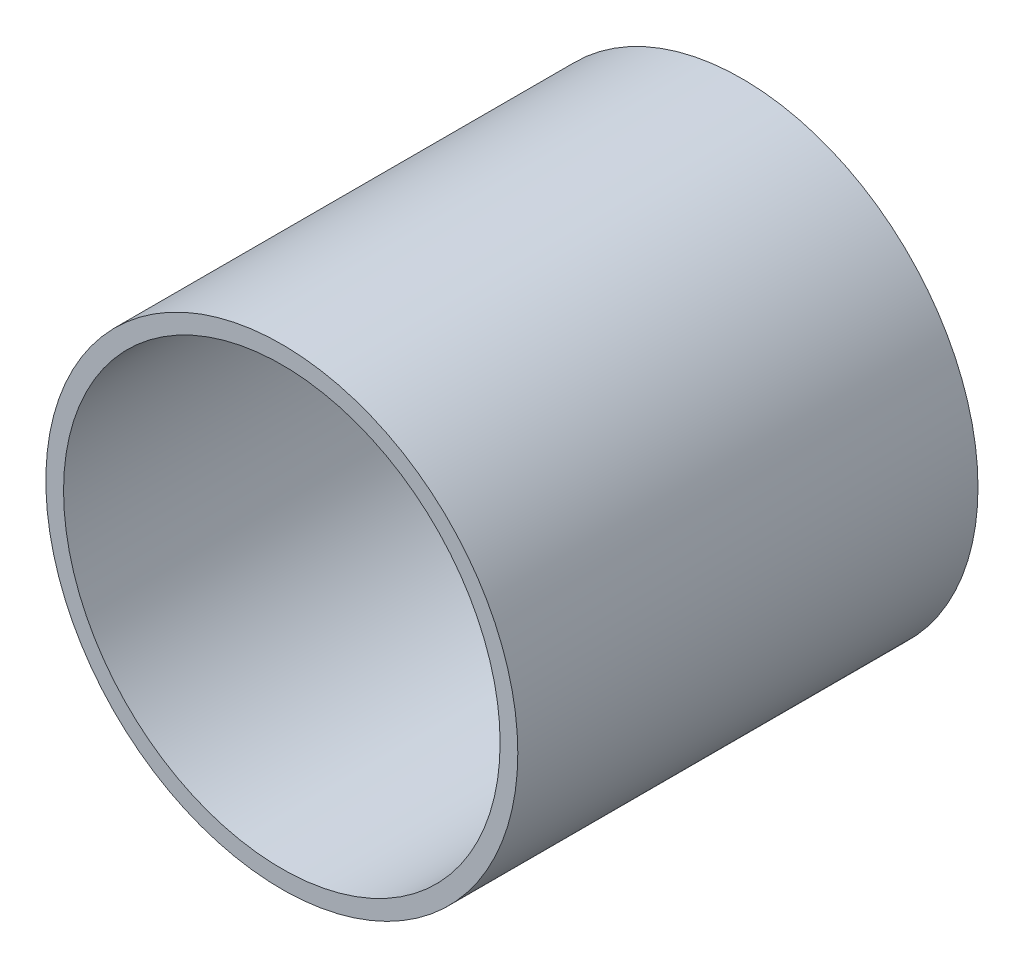
ISO-10303-21;
HEADER;
FILE_DESCRIPTION(('STEP AP214'),'2;1');
FILE_NAME('part.step','',(''),(''),'','','');
FILE_SCHEMA(('AUTOMOTIVE_DESIGN { 1 0 10303 214 1 1 1 1 }'));
ENDSEC;
DATA;
#1=APPLICATION_CONTEXT('core data for automotive mechanical design processes');
#2=APPLICATION_PROTOCOL_DEFINITION('international standard','automotive_design',2000,#1);
#3=PRODUCT_CONTEXT('',#1,'mechanical');
#4=PRODUCT('Part','Part','',(#3));
#5=PRODUCT_RELATED_PRODUCT_CATEGORY('part','',(#4));
#6=PRODUCT_DEFINITION_FORMATION('','',#4);
#7=PRODUCT_DEFINITION_CONTEXT('part definition',#1,'design');
#8=PRODUCT_DEFINITION('design','',#6,#7);
#9=PRODUCT_DEFINITION_SHAPE('','',#8);
#10=(LENGTH_UNIT() NAMED_UNIT(*) SI_UNIT(.MILLI.,.METRE.));
#11=(NAMED_UNIT(*) PLANE_ANGLE_UNIT() SI_UNIT($,.RADIAN.));
#12=(NAMED_UNIT(*) SI_UNIT($,.STERADIAN.) SOLID_ANGLE_UNIT());
#13=UNCERTAINTY_MEASURE_WITH_UNIT(LENGTH_MEASURE(1.E-05),#10,'distance_accuracy_value','');
#14=(GEOMETRIC_REPRESENTATION_CONTEXT(3) GLOBAL_UNCERTAINTY_ASSIGNED_CONTEXT((#13)) GLOBAL_UNIT_ASSIGNED_CONTEXT((#10,
#11,#12)) REPRESENTATION_CONTEXT('',''));
#15=CARTESIAN_POINT('',(0.,0.,0.));
#16=DIRECTION('',(0.,0.,1.));
#17=DIRECTION('',(1.,0.,0.));
#18=AXIS2_PLACEMENT_3D('',#15,#16,#17);
#19=CARTESIAN_POINT('',(0.,0.,78.));
#20=DIRECTION('',(0.,0.,1.));
#21=DIRECTION('',(1.,0.,0.));
#22=AXIS2_PLACEMENT_3D('',#19,#20,#21);
#23=PLANE('',#22);
#24=CARTESIAN_POINT('',(0.,0.,78.));
#25=DIRECTION('',(0.,0.,1.));
#26=DIRECTION('',(1.,0.,0.));
#27=AXIS2_PLACEMENT_3D('',#24,#25,#26);
#28=CIRCLE('',#27,40.);
#29=CARTESIAN_POINT('',(40.,0.,78.));
#30=VERTEX_POINT('',#29);
#31=EDGE_CURVE('E10',#30,#30,#28,.T.);
#32=ORIENTED_EDGE('',*,*,#31,.T.);
#33=EDGE_LOOP('',(#32));
#34=FACE_BOUND('',#33,.T.);
#35=CARTESIAN_POINT('',(0.,0.,78.));
#36=DIRECTION('',(0.,0.,1.));
#37=DIRECTION('',(1.,0.,0.));
#38=AXIS2_PLACEMENT_3D('',#35,#36,#37);
#39=CIRCLE('',#38,37.);
#40=CARTESIAN_POINT('',(37.,0.,78.));
#41=VERTEX_POINT('',#40);
#42=EDGE_CURVE('E42',#41,#41,#39,.T.);
#43=ORIENTED_EDGE('',*,*,#42,.F.);
#44=EDGE_LOOP('',(#43));
#45=FACE_BOUND('',#44,.T.);
#46=ADVANCED_FACE('F31',(#34,#45),#23,.T.);
#47=CARTESIAN_POINT('',(0.,0.,0.));
#48=DIRECTION('',(0.,0.,1.));
#49=DIRECTION('',(1.,0.,0.));
#50=AXIS2_PLACEMENT_3D('',#47,#48,#49);
#51=PLANE('',#50);
#52=CARTESIAN_POINT('',(0.,0.,0.));
#53=DIRECTION('',(0.,0.,1.));
#54=DIRECTION('',(1.,0.,0.));
#55=AXIS2_PLACEMENT_3D('',#52,#53,#54);
#56=CIRCLE('',#55,40.);
#57=CARTESIAN_POINT('',(40.,0.,0.));
#58=VERTEX_POINT('',#57);
#59=EDGE_CURVE('E35',#58,#58,#56,.T.);
#60=ORIENTED_EDGE('',*,*,#59,.F.);
#61=EDGE_LOOP('',(#60));
#62=FACE_BOUND('',#61,.T.);
#63=CARTESIAN_POINT('',(0.,0.,0.));
#64=DIRECTION('',(0.,0.,1.));
#65=DIRECTION('',(1.,0.,0.));
#66=AXIS2_PLACEMENT_3D('',#63,#64,#65);
#67=CIRCLE('',#66,37.);
#68=CARTESIAN_POINT('',(37.,0.,0.));
#69=VERTEX_POINT('',#68);
#70=EDGE_CURVE('E44',#69,#69,#67,.T.);
#71=ORIENTED_EDGE('',*,*,#70,.T.);
#72=EDGE_LOOP('',(#71));
#73=FACE_BOUND('',#72,.T.);
#74=ADVANCED_FACE('F54',(#62,#73),#51,.F.);
#75=CARTESIAN_POINT('',(0.,0.,78.));
#76=DIRECTION('',(0.,0.,-1.));
#77=DIRECTION('',(-1.,0.,0.));
#78=AXIS2_PLACEMENT_3D('',#75,#76,#77);
#79=CYLINDRICAL_SURFACE('',#78,40.);
#80=ORIENTED_EDGE('',*,*,#31,.F.);
#81=EDGE_LOOP('',(#80));
#82=FACE_BOUND('',#81,.T.);
#83=ORIENTED_EDGE('',*,*,#59,.T.);
#84=EDGE_LOOP('',(#83));
#85=FACE_BOUND('',#84,.T.);
#86=ADVANCED_FACE('F33',(#82,#85),#79,.T.);
#87=CARTESIAN_POINT('',(0.,0.,78.));
#88=DIRECTION('',(0.,0.,-1.));
#89=DIRECTION('',(-1.,0.,0.));
#90=AXIS2_PLACEMENT_3D('',#87,#88,#89);
#91=CYLINDRICAL_SURFACE('',#90,37.);
#92=ORIENTED_EDGE('',*,*,#42,.T.);
#93=EDGE_LOOP('',(#92));
#94=FACE_BOUND('',#93,.T.);
#95=ORIENTED_EDGE('',*,*,#70,.F.);
#96=EDGE_LOOP('',(#95));
#97=FACE_BOUND('',#96,.T.);
#98=ADVANCED_FACE('F50',(#94,#97),#91,.F.);
#99=CLOSED_SHELL('',(#46,#74,#86,#98));
#100=MANIFOLD_SOLID_BREP('B2',#99);
#101=ADVANCED_BREP_SHAPE_REPRESENTATION('',(#18,#100),#14);
#102=SHAPE_DEFINITION_REPRESENTATION(#9,#101);
ENDSEC;
END-ISO-10303-21;
